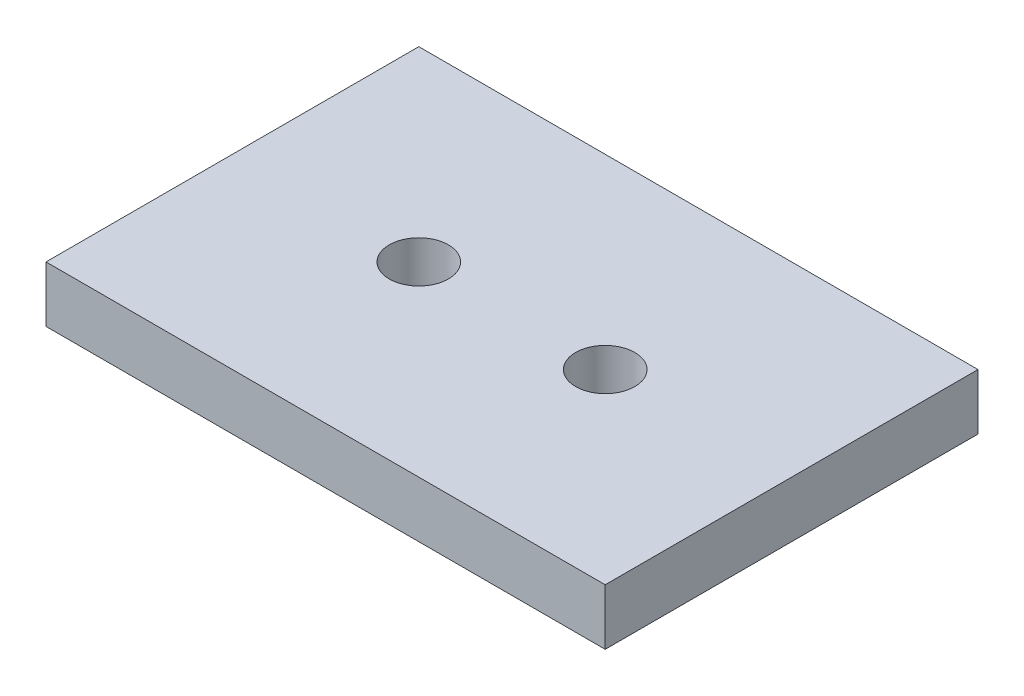
ISO-10303-21;
HEADER;
FILE_DESCRIPTION(('STEP AP214'),'2;1');
FILE_NAME('part.step','',(''),(''),'','','');
FILE_SCHEMA(('AUTOMOTIVE_DESIGN { 1 0 10303 214 1 1 1 1 }'));
ENDSEC;
DATA;
#1=APPLICATION_CONTEXT('core data for automotive mechanical design processes');
#2=APPLICATION_PROTOCOL_DEFINITION('international standard','automotive_design',2000,#1);
#3=PRODUCT_CONTEXT('',#1,'mechanical');
#4=PRODUCT('Part','Part','',(#3));
#5=PRODUCT_RELATED_PRODUCT_CATEGORY('part','',(#4));
#6=PRODUCT_DEFINITION_FORMATION('','',#4);
#7=PRODUCT_DEFINITION_CONTEXT('part definition',#1,'design');
#8=PRODUCT_DEFINITION('design','',#6,#7);
#9=PRODUCT_DEFINITION_SHAPE('','',#8);
#10=(LENGTH_UNIT() NAMED_UNIT(*) SI_UNIT(.MILLI.,.METRE.));
#11=(NAMED_UNIT(*) PLANE_ANGLE_UNIT() SI_UNIT($,.RADIAN.));
#12=(NAMED_UNIT(*) SI_UNIT($,.STERADIAN.) SOLID_ANGLE_UNIT());
#13=UNCERTAINTY_MEASURE_WITH_UNIT(LENGTH_MEASURE(1.E-05),#10,'distance_accuracy_value','');
#14=(GEOMETRIC_REPRESENTATION_CONTEXT(3) GLOBAL_UNCERTAINTY_ASSIGNED_CONTEXT((#13)) GLOBAL_UNIT_ASSIGNED_CONTEXT((#10,
#11,#12)) REPRESENTATION_CONTEXT('',''));
#15=CARTESIAN_POINT('',(0.,0.,0.));
#16=DIRECTION('',(0.,0.,1.));
#17=DIRECTION('',(1.,0.,0.));
#18=AXIS2_PLACEMENT_3D('',#15,#16,#17);
#19=CARTESIAN_POINT('',(15.,3.,0.));
#20=DIRECTION('',(1.,0.,0.));
#21=DIRECTION('',(0.,0.,-1.));
#22=AXIS2_PLACEMENT_3D('',#19,#20,#21);
#23=PLANE('',#22);
#24=DIRECTION('',(0.,0.,1.));
#25=VECTOR('',#24,1.);
#26=CARTESIAN_POINT('',(15.,0.,0.));
#27=LINE('',#26,#25);
#28=CARTESIAN_POINT('',(15.,0.,-10.));
#29=VERTEX_POINT('',#28);
#30=CARTESIAN_POINT('',(15.,0.,10.));
#31=VERTEX_POINT('',#30);
#32=EDGE_CURVE('E105',#29,#31,#27,.T.);
#33=ORIENTED_EDGE('',*,*,#32,.F.);
#34=DIRECTION('',(0.,-1.,0.));
#35=VECTOR('',#34,1.);
#36=CARTESIAN_POINT('',(15.,3.,-10.));
#37=LINE('',#36,#35);
#38=CARTESIAN_POINT('',(15.,3.,-10.));
#39=VERTEX_POINT('',#38);
#40=EDGE_CURVE('E11',#39,#29,#37,.T.);
#41=ORIENTED_EDGE('',*,*,#40,.F.);
#42=DIRECTION('',(0.,0.,1.));
#43=VECTOR('',#42,1.);
#44=CARTESIAN_POINT('',(15.,3.,0.));
#45=LINE('',#44,#43);
#46=CARTESIAN_POINT('',(15.,3.,10.));
#47=VERTEX_POINT('',#46);
#48=EDGE_CURVE('E93',#39,#47,#45,.T.);
#49=ORIENTED_EDGE('',*,*,#48,.T.);
#50=DIRECTION('',(0.,-1.,0.));
#51=VECTOR('',#50,1.);
#52=CARTESIAN_POINT('',(15.,3.,10.));
#53=LINE('',#52,#51);
#54=EDGE_CURVE('E73',#47,#31,#53,.T.);
#55=ORIENTED_EDGE('',*,*,#54,.T.);
#56=EDGE_LOOP('',(#33,#41,#49,#55));
#57=FACE_BOUND('',#56,.T.);
#58=ADVANCED_FACE('F35',(#57),#23,.T.);
#59=CARTESIAN_POINT('',(0.,3.,-10.));
#60=DIRECTION('',(0.,0.,-1.));
#61=DIRECTION('',(-1.,0.,0.));
#62=AXIS2_PLACEMENT_3D('',#59,#60,#61);
#63=PLANE('',#62);
#64=DIRECTION('',(1.,0.,0.));
#65=VECTOR('',#64,1.);
#66=CARTESIAN_POINT('',(0.,0.,-10.));
#67=LINE('',#66,#65);
#68=CARTESIAN_POINT('',(-15.,0.,-10.));
#69=VERTEX_POINT('',#68);
#70=EDGE_CURVE('E86',#69,#29,#67,.T.);
#71=ORIENTED_EDGE('',*,*,#70,.F.);
#72=DIRECTION('',(0.,-1.,0.));
#73=VECTOR('',#72,1.);
#74=CARTESIAN_POINT('',(-15.,3.,-10.));
#75=LINE('',#74,#73);
#76=CARTESIAN_POINT('',(-15.,3.,-10.));
#77=VERTEX_POINT('',#76);
#78=EDGE_CURVE('E43',#77,#69,#75,.T.);
#79=ORIENTED_EDGE('',*,*,#78,.F.);
#80=DIRECTION('',(1.,0.,0.));
#81=VECTOR('',#80,1.);
#82=CARTESIAN_POINT('',(0.,3.,-10.));
#83=LINE('',#82,#81);
#84=EDGE_CURVE('E84',#77,#39,#83,.T.);
#85=ORIENTED_EDGE('',*,*,#84,.T.);
#86=ORIENTED_EDGE('',*,*,#40,.T.);
#87=EDGE_LOOP('',(#71,#79,#85,#86));
#88=FACE_BOUND('',#87,.T.);
#89=ADVANCED_FACE('F82',(#88),#63,.T.);
#90=CARTESIAN_POINT('',(-15.,3.,0.));
#91=DIRECTION('',(1.,0.,0.));
#92=DIRECTION('',(0.,0.,-1.));
#93=AXIS2_PLACEMENT_3D('',#90,#91,#92);
#94=PLANE('',#93);
#95=DIRECTION('',(0.,0.,1.));
#96=VECTOR('',#95,1.);
#97=CARTESIAN_POINT('',(-15.,0.,0.));
#98=LINE('',#97,#96);
#99=CARTESIAN_POINT('',(-15.,0.,10.));
#100=VERTEX_POINT('',#99);
#101=EDGE_CURVE('E66',#69,#100,#98,.T.);
#102=ORIENTED_EDGE('',*,*,#101,.T.);
#103=DIRECTION('',(0.,-1.,0.));
#104=VECTOR('',#103,1.);
#105=CARTESIAN_POINT('',(-15.,3.,10.));
#106=LINE('',#105,#104);
#107=CARTESIAN_POINT('',(-15.,3.,10.));
#108=VERTEX_POINT('',#107);
#109=EDGE_CURVE('E87',#108,#100,#106,.T.);
#110=ORIENTED_EDGE('',*,*,#109,.F.);
#111=DIRECTION('',(0.,0.,1.));
#112=VECTOR('',#111,1.);
#113=CARTESIAN_POINT('',(-15.,3.,0.));
#114=LINE('',#113,#112);
#115=EDGE_CURVE('E88',#77,#108,#114,.T.);
#116=ORIENTED_EDGE('',*,*,#115,.F.);
#117=ORIENTED_EDGE('',*,*,#78,.T.);
#118=EDGE_LOOP('',(#102,#110,#116,#117));
#119=FACE_BOUND('',#118,.T.);
#120=ADVANCED_FACE('F89',(#119),#94,.F.);
#121=CARTESIAN_POINT('',(5.,3.,0.));
#122=DIRECTION('',(0.,-1.,0.));
#123=DIRECTION('',(0.,0.,-1.));
#124=AXIS2_PLACEMENT_3D('',#121,#122,#123);
#125=CYLINDRICAL_SURFACE('',#124,1.5875);
#126=CARTESIAN_POINT('',(5.,3.,0.));
#127=DIRECTION('',(0.,1.,0.));
#128=DIRECTION('',(0.,0.,1.));
#129=AXIS2_PLACEMENT_3D('',#126,#127,#128);
#130=CIRCLE('',#129,1.5875);
#131=CARTESIAN_POINT('',(5.,3.,1.5875));
#132=VERTEX_POINT('',#131);
#133=EDGE_CURVE('E99',#132,#132,#130,.F.);
#134=ORIENTED_EDGE('',*,*,#133,.F.);
#135=EDGE_LOOP('',(#134));
#136=FACE_BOUND('',#135,.T.);
#137=CARTESIAN_POINT('',(5.,0.,0.));
#138=DIRECTION('',(0.,1.,0.));
#139=DIRECTION('',(0.,0.,1.));
#140=AXIS2_PLACEMENT_3D('',#137,#138,#139);
#141=CIRCLE('',#140,1.5875);
#142=CARTESIAN_POINT('',(5.,0.,1.5875));
#143=VERTEX_POINT('',#142);
#144=EDGE_CURVE('E112',#143,#143,#141,.F.);
#145=ORIENTED_EDGE('',*,*,#144,.T.);
#146=EDGE_LOOP('',(#145));
#147=FACE_BOUND('',#146,.T.);
#148=ADVANCED_FACE('F131',(#136,#147),#125,.F.);
#149=CARTESIAN_POINT('',(0.,3.,10.));
#150=DIRECTION('',(0.,0.,-1.));
#151=DIRECTION('',(-1.,0.,0.));
#152=AXIS2_PLACEMENT_3D('',#149,#150,#151);
#153=PLANE('',#152);
#154=DIRECTION('',(1.,0.,0.));
#155=VECTOR('',#154,1.);
#156=CARTESIAN_POINT('',(0.,0.,10.));
#157=LINE('',#156,#155);
#158=EDGE_CURVE('E110',#100,#31,#157,.T.);
#159=ORIENTED_EDGE('',*,*,#158,.T.);
#160=ORIENTED_EDGE('',*,*,#54,.F.);
#161=DIRECTION('',(1.,0.,0.));
#162=VECTOR('',#161,1.);
#163=CARTESIAN_POINT('',(0.,3.,10.));
#164=LINE('',#163,#162);
#165=EDGE_CURVE('E51',#108,#47,#164,.T.);
#166=ORIENTED_EDGE('',*,*,#165,.F.);
#167=ORIENTED_EDGE('',*,*,#109,.T.);
#168=EDGE_LOOP('',(#159,#160,#166,#167));
#169=FACE_BOUND('',#168,.T.);
#170=ADVANCED_FACE('F120',(#169),#153,.F.);
#171=CARTESIAN_POINT('',(-5.,3.,0.));
#172=DIRECTION('',(0.,-1.,0.));
#173=DIRECTION('',(0.,0.,-1.));
#174=AXIS2_PLACEMENT_3D('',#171,#172,#173);
#175=CYLINDRICAL_SURFACE('',#174,1.5875);
#176=CARTESIAN_POINT('',(-5.,3.,0.));
#177=DIRECTION('',(0.,1.,0.));
#178=DIRECTION('',(0.,0.,1.));
#179=AXIS2_PLACEMENT_3D('',#176,#177,#178);
#180=CIRCLE('',#179,1.5875);
#181=CARTESIAN_POINT('',(-5.,3.,1.5875));
#182=VERTEX_POINT('',#181);
#183=EDGE_CURVE('E102',#182,#182,#180,.T.);
#184=ORIENTED_EDGE('',*,*,#183,.T.);
#185=EDGE_LOOP('',(#184));
#186=FACE_BOUND('',#185,.T.);
#187=CARTESIAN_POINT('',(-5.,0.,0.));
#188=DIRECTION('',(0.,1.,0.));
#189=DIRECTION('',(0.,0.,1.));
#190=AXIS2_PLACEMENT_3D('',#187,#188,#189);
#191=CIRCLE('',#190,1.5875);
#192=CARTESIAN_POINT('',(-5.,0.,1.5875));
#193=VERTEX_POINT('',#192);
#194=EDGE_CURVE('E95',#193,#193,#191,.T.);
#195=ORIENTED_EDGE('',*,*,#194,.F.);
#196=EDGE_LOOP('',(#195));
#197=FACE_BOUND('',#196,.T.);
#198=ADVANCED_FACE('F136',(#186,#197),#175,.F.);
#199=CARTESIAN_POINT('',(0.,3.,0.));
#200=DIRECTION('',(0.,1.,0.));
#201=DIRECTION('',(0.,0.,1.));
#202=AXIS2_PLACEMENT_3D('',#199,#200,#201);
#203=PLANE('',#202);
#204=ORIENTED_EDGE('',*,*,#48,.F.);
#205=ORIENTED_EDGE('',*,*,#84,.F.);
#206=ORIENTED_EDGE('',*,*,#115,.T.);
#207=ORIENTED_EDGE('',*,*,#165,.T.);
#208=EDGE_LOOP('',(#204,#205,#206,#207));
#209=FACE_BOUND('',#208,.T.);
#210=ORIENTED_EDGE('',*,*,#133,.T.);
#211=EDGE_LOOP('',(#210));
#212=FACE_BOUND('',#211,.T.);
#213=ORIENTED_EDGE('',*,*,#183,.F.);
#214=EDGE_LOOP('',(#213));
#215=FACE_BOUND('',#214,.T.);
#216=ADVANCED_FACE('F91',(#209,#212,#215),#203,.T.);
#217=CARTESIAN_POINT('',(0.,0.,0.));
#218=DIRECTION('',(0.,1.,0.));
#219=DIRECTION('',(0.,0.,1.));
#220=AXIS2_PLACEMENT_3D('',#217,#218,#219);
#221=PLANE('',#220);
#222=ORIENTED_EDGE('',*,*,#32,.T.);
#223=ORIENTED_EDGE('',*,*,#158,.F.);
#224=ORIENTED_EDGE('',*,*,#101,.F.);
#225=ORIENTED_EDGE('',*,*,#70,.T.);
#226=EDGE_LOOP('',(#222,#223,#224,#225));
#227=FACE_BOUND('',#226,.T.);
#228=ORIENTED_EDGE('',*,*,#144,.F.);
#229=EDGE_LOOP('',(#228));
#230=FACE_BOUND('',#229,.T.);
#231=ORIENTED_EDGE('',*,*,#194,.T.);
#232=EDGE_LOOP('',(#231));
#233=FACE_BOUND('',#232,.T.);
#234=ADVANCED_FACE('F122',(#227,#230,#233),#221,.F.);
#235=CLOSED_SHELL('',(#58,#89,#120,#148,#170,#198,#216,#234));
#236=MANIFOLD_SOLID_BREP('B2',#235);
#237=ADVANCED_BREP_SHAPE_REPRESENTATION('',(#18,#236),#14);
#238=SHAPE_DEFINITION_REPRESENTATION(#9,#237);
ENDSEC;
END-ISO-10303-21;
